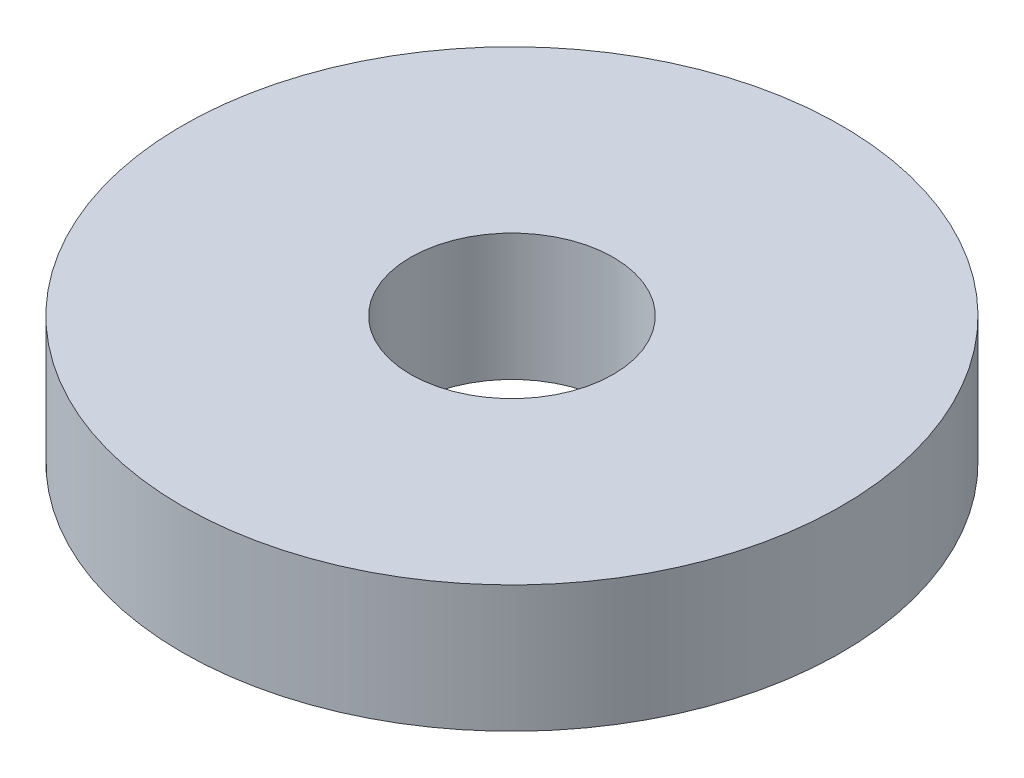
ISO-10303-21;
HEADER;
FILE_DESCRIPTION(('STEP AP214'),'2;1');
FILE_NAME('part.step','',(''),(''),'','','');
FILE_SCHEMA(('AUTOMOTIVE_DESIGN { 1 0 10303 214 1 1 1 1 }'));
ENDSEC;
DATA;
#1=APPLICATION_CONTEXT('core data for automotive mechanical design processes');
#2=APPLICATION_PROTOCOL_DEFINITION('international standard','automotive_design',2000,#1);
#3=PRODUCT_CONTEXT('',#1,'mechanical');
#4=PRODUCT('Part','Part','',(#3));
#5=PRODUCT_RELATED_PRODUCT_CATEGORY('part','',(#4));
#6=PRODUCT_DEFINITION_FORMATION('','',#4);
#7=PRODUCT_DEFINITION_CONTEXT('part definition',#1,'design');
#8=PRODUCT_DEFINITION('design','',#6,#7);
#9=PRODUCT_DEFINITION_SHAPE('','',#8);
#10=(LENGTH_UNIT() NAMED_UNIT(*) SI_UNIT(.MILLI.,.METRE.));
#11=(NAMED_UNIT(*) PLANE_ANGLE_UNIT() SI_UNIT($,.RADIAN.));
#12=(NAMED_UNIT(*) SI_UNIT($,.STERADIAN.) SOLID_ANGLE_UNIT());
#13=UNCERTAINTY_MEASURE_WITH_UNIT(LENGTH_MEASURE(1.E-05),#10,'distance_accuracy_value','');
#14=(GEOMETRIC_REPRESENTATION_CONTEXT(3) GLOBAL_UNCERTAINTY_ASSIGNED_CONTEXT((#13)) GLOBAL_UNIT_ASSIGNED_CONTEXT((#10,
#11,#12)) REPRESENTATION_CONTEXT('',''));
#15=CARTESIAN_POINT('',(0.,0.,0.));
#16=DIRECTION('',(0.,0.,1.));
#17=DIRECTION('',(1.,0.,0.));
#18=AXIS2_PLACEMENT_3D('',#15,#16,#17);
#19=CARTESIAN_POINT('',(0.,25.,0.));
#20=DIRECTION('',(0.,1.,0.));
#21=DIRECTION('',(0.,0.,1.));
#22=AXIS2_PLACEMENT_3D('',#19,#20,#21);
#23=PLANE('',#22);
#24=CARTESIAN_POINT('',(0.,25.,0.));
#25=DIRECTION('',(0.,1.,0.));
#26=DIRECTION('',(0.,0.,1.));
#27=AXIS2_PLACEMENT_3D('',#24,#25,#26);
#28=CIRCLE('',#27,65.);
#29=CARTESIAN_POINT('',(0.,25.,65.));
#30=VERTEX_POINT('',#29);
#31=EDGE_CURVE('E10',#30,#30,#28,.T.);
#32=ORIENTED_EDGE('',*,*,#31,.T.);
#33=EDGE_LOOP('',(#32));
#34=FACE_BOUND('',#33,.T.);
#35=CARTESIAN_POINT('',(0.,25.,0.));
#36=DIRECTION('',(0.,1.,0.));
#37=DIRECTION('',(0.,0.,1.));
#38=AXIS2_PLACEMENT_3D('',#35,#36,#37);
#39=CIRCLE('',#38,20.);
#40=CARTESIAN_POINT('',(0.,25.,20.));
#41=VERTEX_POINT('',#40);
#42=EDGE_CURVE('E42',#41,#41,#39,.T.);
#43=ORIENTED_EDGE('',*,*,#42,.F.);
#44=EDGE_LOOP('',(#43));
#45=FACE_BOUND('',#44,.T.);
#46=ADVANCED_FACE('F31',(#34,#45),#23,.T.);
#47=CARTESIAN_POINT('',(0.,0.,0.));
#48=DIRECTION('',(0.,1.,0.));
#49=DIRECTION('',(0.,0.,1.));
#50=AXIS2_PLACEMENT_3D('',#47,#48,#49);
#51=PLANE('',#50);
#52=CARTESIAN_POINT('',(0.,0.,0.));
#53=DIRECTION('',(0.,1.,0.));
#54=DIRECTION('',(0.,0.,1.));
#55=AXIS2_PLACEMENT_3D('',#52,#53,#54);
#56=CIRCLE('',#55,65.);
#57=CARTESIAN_POINT('',(0.,0.,65.));
#58=VERTEX_POINT('',#57);
#59=EDGE_CURVE('E35',#58,#58,#56,.T.);
#60=ORIENTED_EDGE('',*,*,#59,.F.);
#61=EDGE_LOOP('',(#60));
#62=FACE_BOUND('',#61,.T.);
#63=CARTESIAN_POINT('',(0.,0.,0.));
#64=DIRECTION('',(0.,1.,0.));
#65=DIRECTION('',(0.,0.,1.));
#66=AXIS2_PLACEMENT_3D('',#63,#64,#65);
#67=CIRCLE('',#66,20.);
#68=CARTESIAN_POINT('',(0.,0.,20.));
#69=VERTEX_POINT('',#68);
#70=EDGE_CURVE('E44',#69,#69,#67,.T.);
#71=ORIENTED_EDGE('',*,*,#70,.T.);
#72=EDGE_LOOP('',(#71));
#73=FACE_BOUND('',#72,.T.);
#74=ADVANCED_FACE('F54',(#62,#73),#51,.F.);
#75=CARTESIAN_POINT('',(0.,25.,0.));
#76=DIRECTION('',(0.,-1.,0.));
#77=DIRECTION('',(0.,0.,-1.));
#78=AXIS2_PLACEMENT_3D('',#75,#76,#77);
#79=CYLINDRICAL_SURFACE('',#78,65.);
#80=ORIENTED_EDGE('',*,*,#31,.F.);
#81=EDGE_LOOP('',(#80));
#82=FACE_BOUND('',#81,.T.);
#83=ORIENTED_EDGE('',*,*,#59,.T.);
#84=EDGE_LOOP('',(#83));
#85=FACE_BOUND('',#84,.T.);
#86=ADVANCED_FACE('F33',(#82,#85),#79,.T.);
#87=CARTESIAN_POINT('',(0.,25.,0.));
#88=DIRECTION('',(0.,-1.,0.));
#89=DIRECTION('',(0.,0.,-1.));
#90=AXIS2_PLACEMENT_3D('',#87,#88,#89);
#91=CYLINDRICAL_SURFACE('',#90,20.);
#92=ORIENTED_EDGE('',*,*,#42,.T.);
#93=EDGE_LOOP('',(#92));
#94=FACE_BOUND('',#93,.T.);
#95=ORIENTED_EDGE('',*,*,#70,.F.);
#96=EDGE_LOOP('',(#95));
#97=FACE_BOUND('',#96,.T.);
#98=ADVANCED_FACE('F50',(#94,#97),#91,.F.);
#99=CLOSED_SHELL('',(#46,#74,#86,#98));
#100=MANIFOLD_SOLID_BREP('B2',#99);
#101=ADVANCED_BREP_SHAPE_REPRESENTATION('',(#18,#100),#14);
#102=SHAPE_DEFINITION_REPRESENTATION(#9,#101);
ENDSEC;
END-ISO-10303-21;
